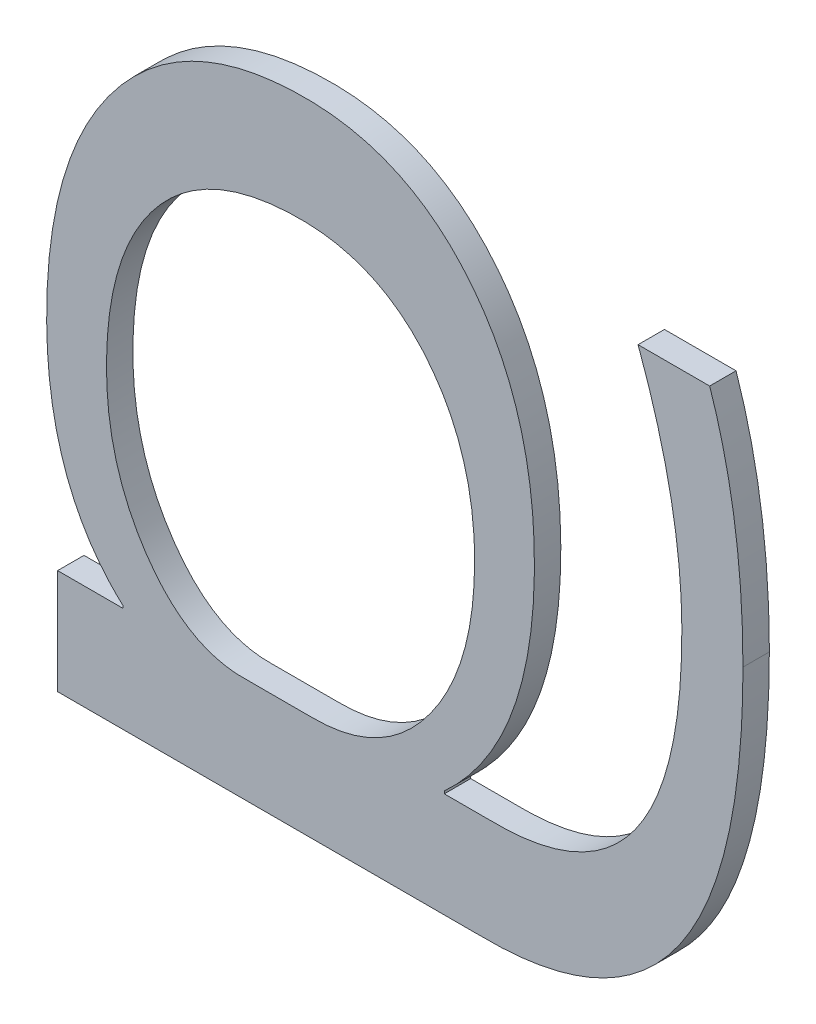
ISO-10303-21;
HEADER;
FILE_DESCRIPTION(('STEP AP214'),'2;1');
FILE_NAME('part.step','',(''),(''),'','','');
FILE_SCHEMA(('AUTOMOTIVE_DESIGN { 1 0 10303 214 1 1 1 1 }'));
ENDSEC;
DATA;
#1=APPLICATION_CONTEXT('core data for automotive mechanical design processes');
#2=APPLICATION_PROTOCOL_DEFINITION('international standard','automotive_design',2000,#1);
#3=PRODUCT_CONTEXT('',#1,'mechanical');
#4=PRODUCT('Part','Part','',(#3));
#5=PRODUCT_RELATED_PRODUCT_CATEGORY('part','',(#4));
#6=PRODUCT_DEFINITION_FORMATION('','',#4);
#7=PRODUCT_DEFINITION_CONTEXT('part definition',#1,'design');
#8=PRODUCT_DEFINITION('design','',#6,#7);
#9=PRODUCT_DEFINITION_SHAPE('','',#8);
#10=(LENGTH_UNIT() NAMED_UNIT(*) SI_UNIT(.MILLI.,.METRE.));
#11=(NAMED_UNIT(*) PLANE_ANGLE_UNIT() SI_UNIT($,.RADIAN.));
#12=(NAMED_UNIT(*) SI_UNIT($,.STERADIAN.) SOLID_ANGLE_UNIT());
#13=UNCERTAINTY_MEASURE_WITH_UNIT(LENGTH_MEASURE(1.E-05),#10,'distance_accuracy_value','');
#14=(GEOMETRIC_REPRESENTATION_CONTEXT(3) GLOBAL_UNCERTAINTY_ASSIGNED_CONTEXT((#13)) GLOBAL_UNIT_ASSIGNED_CONTEXT((#10,
#11,#12)) REPRESENTATION_CONTEXT('',''));
#15=CARTESIAN_POINT('',(0.,0.,0.));
#16=DIRECTION('',(0.,0.,1.));
#17=DIRECTION('',(1.,0.,0.));
#18=AXIS2_PLACEMENT_3D('',#15,#16,#17);
#19=CARTESIAN_POINT('',(-8.95983005625009,-22.770458436575,135.210489149433));
#20=DIRECTION('',(0.,0.,-1.));
#21=DIRECTION('',(0.,-1.,0.));
#22=AXIS2_PLACEMENT_3D('',#19,#20,#21);
#23=PLANE('',#22);
#24=CARTESIAN_POINT('',(-7.31483869507218,-28.3391887175246,135.210489149433));
#25=CARTESIAN_POINT('',(-6.63162029661121,-27.7166297496407,135.210489149433));
#26=CARTESIAN_POINT('',(-6.29001147151449,-26.8019478821879,135.210489149433));
#27=CARTESIAN_POINT('',(-6.29001147151449,-24.5990481492315,135.210489149433));
#28=CARTESIAN_POINT('',(-6.52786116650567,-23.801694366616,135.210489149433));
#29=CARTESIAN_POINT('',(-7.47925776656313,-22.6044660995682,135.210489149433));
#30=CARTESIAN_POINT('',(-8.10820170137054,-22.3051592704092,135.210489149433));
#31=CARTESIAN_POINT('',(-9.79389881675516,-22.3051592704092,135.210489149433));
#32=CARTESIAN_POINT('',(-10.5106393161385,-22.63319950104,135.210489149433));
#33=CARTESIAN_POINT('',(-11.5705852650725,-23.945361625794,135.210489149433));
#34=CARTESIAN_POINT('',(-11.8355718681491,-24.8289159376931,135.210489149433));
#35=CARTESIAN_POINT('',(-11.8355718681491,-27.0174489338707,135.210489149433));
#36=CARTESIAN_POINT('',(-11.5466407037744,-27.8171969070927,135.210489149433));
#37=CARTESIAN_POINT('',(-10.9687786556253,-28.3391887175246,135.210489149433));
#38=(BOUNDED_CURVE() B_SPLINE_CURVE(3,(#24,#25,#26,#27,#28,#29,#30,#31,#32,#33,#34,#35,#36,#37),
.UNSPECIFIED.,.F.,.F.) B_SPLINE_CURVE_WITH_KNOTS((4,2,2,2,2,2,4),(0.,0.182405901512016,
0.332963148336322,0.483520438417726,0.657429439117714,0.831338346330337,1.),
.UNSPECIFIED.) CURVE() GEOMETRIC_REPRESENTATION_ITEM() RATIONAL_B_SPLINE_CURVE((1.,1.,1.,1.,1.,
1.,1.,1.,1.,1.,1.,1.,1.,1.)) REPRESENTATION_ITEM(''));
#39=CARTESIAN_POINT('',(-7.31483869507218,-28.3391887175246,135.210489149433));
#40=VERTEX_POINT('',#39);
#41=CARTESIAN_POINT('',(-10.9687786556253,-28.3391887175246,135.210489149433));
#42=VERTEX_POINT('',#41);
#43=EDGE_CURVE('E55',#40,#42,#38,.T.);
#44=ORIENTED_EDGE('',*,*,#43,.T.);
#45=DIRECTION('',(0.,-1.,0.));
#46=VECTOR('',#45,1.);
#47=CARTESIAN_POINT('',(-10.9687786556253,5.40908312699247,135.210489149433));
#48=LINE('',#47,#46);
#49=CARTESIAN_POINT('',(-10.9687786556253,-28.3679221910822,135.210489149433));
#50=VERTEX_POINT('',#49);
#51=EDGE_CURVE('E215',#42,#50,#48,.T.);
#52=ORIENTED_EDGE('',*,*,#51,.T.);
#53=DIRECTION('',(-1.,0.,0.));
#54=VECTOR('',#53,1.);
#55=CARTESIAN_POINT('',(2.66453525910038E-13,-28.3679221910822,135.210489149433));
#56=LINE('',#55,#54);
#57=CARTESIAN_POINT('',(-11.7110601493991,-28.3679221910822,135.210489149433));
#58=VERTEX_POINT('',#57);
#59=EDGE_CURVE('E256',#50,#58,#56,.T.);
#60=ORIENTED_EDGE('',*,*,#59,.T.);
#61=DIRECTION('',(0.,-1.,0.));
#62=VECTOR('',#61,1.);
#63=CARTESIAN_POINT('',(-11.7110601493991,5.40908312699247,135.210489149433));
#64=LINE('',#63,#62);
#65=CARTESIAN_POINT('',(-11.7110601493991,-29.5603613437265,135.210489149433));
#66=VERTEX_POINT('',#65);
#67=EDGE_CURVE('E255',#58,#66,#64,.T.);
#68=ORIENTED_EDGE('',*,*,#67,.T.);
#69=CARTESIAN_POINT('',(-11.7110601493991,-29.5603613437265,135.210489149433));
#70=CARTESIAN_POINT('',(-10.0844262852164,-29.5603613437265,135.210489149433));
#71=CARTESIAN_POINT('',(-8.45779242103366,-29.5603618140089,135.210489149433));
#72=CARTESIAN_POINT('',(-4.89005303704277,-29.5603607825257,135.210489149433));
#73=CARTESIAN_POINT('',(-3.91949990300487,-28.1811540517566,135.210489149433));
#74=CARTESIAN_POINT('',(-3.91949990300487,-25.4227411163436,135.210489149433));
#75=(BOUNDED_CURVE() B_SPLINE_CURVE(3,(#69,#70,#71,#72,#73,#74),.UNSPECIFIED.,.F.,
.F.) B_SPLINE_CURVE_WITH_KNOTS((4,2,4),(0.,0.455928443507292,1.),
.UNSPECIFIED.) CURVE() GEOMETRIC_REPRESENTATION_ITEM() RATIONAL_B_SPLINE_CURVE((1.,1.,1.,1.,1.,1.)) REPRESENTATION_ITEM(''));
#76=CARTESIAN_POINT('',(-3.91949990300487,-25.4227411163436,135.210489149433));
#77=VERTEX_POINT('',#76);
#78=EDGE_CURVE('E11',#66,#77,#75,.T.);
#79=ORIENTED_EDGE('',*,*,#78,.T.);
#80=CARTESIAN_POINT('',(-3.91949990300487,-25.4227411163436,135.210489149433));
#81=CARTESIAN_POINT('',(-3.91949990300487,-24.4458030504572,135.210489149433));
#82=CARTESIAN_POINT('',(-4.04560842468644,-23.5861932063229,135.210489149433));
#83=CARTESIAN_POINT('',(-4.29782397151449,-22.8439118996158,135.210489149433));
#84=(BOUNDED_CURVE() B_SPLINE_CURVE(3,(#80,#81,#82,#83),.UNSPECIFIED.,.F.,
.F.) B_SPLINE_CURVE_WITH_KNOTS((4,4),(0.,1.),
.UNSPECIFIED.) CURVE() GEOMETRIC_REPRESENTATION_ITEM() RATIONAL_B_SPLINE_CURVE((1.,1.,1.,1.)) REPRESENTATION_ITEM(''));
#85=CARTESIAN_POINT('',(-4.29782397151449,-22.8439118996158,135.210489149433));
#86=VERTEX_POINT('',#85);
#87=EDGE_CURVE('E129',#77,#86,#84,.T.);
#88=ORIENTED_EDGE('',*,*,#87,.T.);
#89=DIRECTION('',(-1.,0.,0.));
#90=VECTOR('',#89,1.);
#91=CARTESIAN_POINT('',(2.66453525910038E-13,-22.8439118996158,135.210489149433));
#92=LINE('',#91,#90);
#93=CARTESIAN_POINT('',(-5.11193905564911,-22.8439118996158,135.210489149433));
#94=VERTEX_POINT('',#93);
#95=EDGE_CURVE('E135',#86,#94,#92,.T.);
#96=ORIENTED_EDGE('',*,*,#95,.T.);
#97=CARTESIAN_POINT('',(-5.11193905564911,-22.8439118996158,135.210489149433));
#98=CARTESIAN_POINT('',(-4.77990805507162,-23.7394384453972,135.210489149433));
#99=CARTESIAN_POINT('',(-4.61389218064911,-24.596653786635,135.210489149433));
#100=CARTESIAN_POINT('',(-4.61389218064911,-27.3838007217312,135.210489149433));
#101=CARTESIAN_POINT('',(-5.31786228281257,-28.3679221910822,135.210489149433));
#102=CARTESIAN_POINT('',(-6.92214788978372,-28.3679221910822,135.210489149433));
#103=CARTESIAN_POINT('',(-7.11849329242795,-28.3679221910822,135.210489149433));
#104=CARTESIAN_POINT('',(-7.31483869507218,-28.3679221910822,135.210489149433));
#105=(BOUNDED_CURVE() B_SPLINE_CURVE(3,(#97,#98,#99,#100,#101,#102,#103,#104),.UNSPECIFIED.,.F.,
.F.) B_SPLINE_CURVE_WITH_KNOTS((4,2,2,4),(0.,0.267473237427529,0.910347470849338,1.),
.UNSPECIFIED.) CURVE() GEOMETRIC_REPRESENTATION_ITEM() RATIONAL_B_SPLINE_CURVE((1.,1.,1.,1.,1.,
1.,1.,1.)) REPRESENTATION_ITEM(''));
#106=CARTESIAN_POINT('',(-7.31483869507218,-28.3679221910822,135.210489149433));
#107=VERTEX_POINT('',#106);
#108=EDGE_CURVE('E172',#94,#107,#105,.T.);
#109=ORIENTED_EDGE('',*,*,#108,.T.);
#110=DIRECTION('',(0.,1.,0.));
#111=VECTOR('',#110,1.);
#112=CARTESIAN_POINT('',(-7.31483869507218,5.40908312699247,135.210489149433));
#113=LINE('',#112,#111);
#114=EDGE_CURVE('E237',#107,#40,#113,.T.);
#115=ORIENTED_EDGE('',*,*,#114,.T.);
#116=EDGE_LOOP('',(#44,#52,#60,#68,#79,#88,#96,#109,#115));
#117=FACE_BOUND('',#116,.T.);
#118=CARTESIAN_POINT('',(-6.97003701237988,-25.9040268159725,135.210489149433));
#119=CARTESIAN_POINT('',(-6.97003701237988,-26.617574386059,135.210489149433));
#120=CARTESIAN_POINT('',(-7.14163918404078,-27.2066107921608,135.210489149433));
#121=CARTESIAN_POINT('',(-7.82805070831681,-28.1356597594239,135.210489149433));
#122=CARTESIAN_POINT('',(-8.26623580593785,-28.3679221910822,135.210489149433));
#123=CARTESIAN_POINT('',(-9.0675805937831,-28.3679221910822,135.210489149433));
#124=CARTESIAN_POINT('',(-9.33575969201324,-28.3679221910822,135.210489149433));
#125=CARTESIAN_POINT('',(-10.0349408585337,-28.3679221910822,135.210489149433));
#126=CARTESIAN_POINT('',(-10.4012929028442,-28.1452379447341,135.210489149433));
#127=CARTESIAN_POINT('',(-11.0046952169721,-27.2545000907216,135.210489149433));
#128=CARTESIAN_POINT('',(-11.1555466225336,-26.7181415435109,135.210489149433));
#129=CARTESIAN_POINT('',(-11.1555459531499,-25.2958348830055,135.210489149433));
#130=CARTESIAN_POINT('',(-10.9607970576415,-24.6696844448101,135.210489149433));
#131=CARTESIAN_POINT('',(-10.181800709784,-23.7550023634743,135.210489149433));
#132=CARTESIAN_POINT('',(-9.64065362444746,-23.5263318966111,135.210489149433));
#133=CARTESIAN_POINT('',(-8.34764731435131,-23.5263318966111,135.210489149433));
#134=CARTESIAN_POINT('',(-7.86795819848005,-23.7466217855155,135.210489149433));
#135=CARTESIAN_POINT('',(-7.14962122211545,-24.6277816227891,135.210489149433));
#136=CARTESIAN_POINT('',(-6.97003701237988,-25.2000567313467,135.210489149433));
#137=CARTESIAN_POINT('',(-6.97003701237988,-25.9040268159725,135.210489149433));
#138=(BOUNDED_CURVE() B_SPLINE_CURVE(3,(#118,#119,#120,#121,#122,#123,#124,#125,#126,#127,#128,
#129,#130,#131,#132,#133,#134,#135,#136,#137),.UNSPECIFIED.,.T.,
.F.) B_SPLINE_CURVE_WITH_KNOTS((4,2,2,2,2,2,2,2,2,4),(0.,0.125890394873445,0.251780691362057,
0.315102744610858,0.416870317470706,0.518637850634323,0.647595281264441,0.776552809828459,
0.888276426287641,1.),
.UNSPECIFIED.) CURVE() GEOMETRIC_REPRESENTATION_ITEM() RATIONAL_B_SPLINE_CURVE((1.,1.,1.,1.,1.,
1.,1.,1.,1.,1.,1.,1.,1.,1.,1.,1.,1.,1.,1.,1.)) REPRESENTATION_ITEM(''));
#139=CARTESIAN_POINT('',(-6.97003701237988,-25.9040268159725,135.210489149433));
#140=VERTEX_POINT('',#139);
#141=EDGE_CURVE('E246',#140,#140,#138,.T.);
#142=ORIENTED_EDGE('',*,*,#141,.T.);
#143=EDGE_LOOP('',(#142));
#144=FACE_BOUND('',#143,.T.);
#145=ADVANCED_FACE('F42',(#117,#144),#23,.F.);
#146=CARTESIAN_POINT('',(-11.7110601493991,-29.5603613437265,135.410489149433));
#147=CARTESIAN_POINT('',(-10.0844262852164,-29.5603613437265,135.410489149433));
#148=CARTESIAN_POINT('',(-8.45779242103366,-29.5603618140089,135.410489149433));
#149=CARTESIAN_POINT('',(-4.89005303704277,-29.5603607825257,135.410489149433));
#150=CARTESIAN_POINT('',(-3.91949990300487,-28.1811540517566,135.410489149433));
#151=CARTESIAN_POINT('',(-3.91949990300487,-25.4227411163436,135.410489149433));
#152=(BOUNDED_CURVE() B_SPLINE_CURVE(3,(#146,#147,#148,#149,#150,#151),.UNSPECIFIED.,.F.,
.F.) B_SPLINE_CURVE_WITH_KNOTS((4,2,4),(0.,0.455928443507292,1.),
.UNSPECIFIED.) CURVE() GEOMETRIC_REPRESENTATION_ITEM() RATIONAL_B_SPLINE_CURVE((1.,1.,1.,1.,1.,1.)) REPRESENTATION_ITEM(''));
#153=DIRECTION('',(0.,0.,-1.));
#154=VECTOR('',#153,1.);
#155=SURFACE_OF_LINEAR_EXTRUSION('',#152,#154);
#156=ORIENTED_EDGE('',*,*,#78,.F.);
#157=CARTESIAN_POINT('',(-11.7110601493991,-29.5603613437265,135.210489149433));
#158=CARTESIAN_POINT('',(-11.7110601493991,-29.5603613437265,134.910489149433));
#159=(BOUNDED_CURVE() B_SPLINE_CURVE(1,(#157,#158),.UNSPECIFIED.,.F.,
.F.) B_SPLINE_CURVE_WITH_KNOTS((2,2),(0.,1.),
.UNSPECIFIED.) CURVE() GEOMETRIC_REPRESENTATION_ITEM() RATIONAL_B_SPLINE_CURVE((1.,1.)) REPRESENTATION_ITEM(''));
#160=CARTESIAN_POINT('',(-11.7110601493991,-29.5603613437265,134.910489149433));
#161=VERTEX_POINT('',#160);
#162=EDGE_CURVE('E165',#66,#161,#159,.T.);
#163=ORIENTED_EDGE('',*,*,#162,.T.);
#164=CARTESIAN_POINT('',(-3.91949990300487,-25.4227411163436,134.910489149433));
#165=CARTESIAN_POINT('',(-3.91949990300487,-28.1811540517566,134.910489149433));
#166=CARTESIAN_POINT('',(-4.89005303704277,-29.5603607825257,134.910489149433));
#167=CARTESIAN_POINT('',(-8.45779242103366,-29.5603618140089,134.910489149433));
#168=CARTESIAN_POINT('',(-10.0844262852164,-29.5603613437265,134.910489149433));
#169=CARTESIAN_POINT('',(-11.7110601493991,-29.5603613437265,134.910489149433));
#170=(BOUNDED_CURVE() B_SPLINE_CURVE(3,(#164,#165,#166,#167,#168,#169),.UNSPECIFIED.,.F.,
.F.) B_SPLINE_CURVE_WITH_KNOTS((4,2,4),(0.,0.544071556492708,1.),
.UNSPECIFIED.) CURVE() GEOMETRIC_REPRESENTATION_ITEM() RATIONAL_B_SPLINE_CURVE((1.,1.,1.,1.,1.,1.)) REPRESENTATION_ITEM(''));
#171=CARTESIAN_POINT('',(-3.91949990300487,-25.4227411163436,134.910489149433));
#172=VERTEX_POINT('',#171);
#173=EDGE_CURVE('E46',#172,#161,#170,.T.);
#174=ORIENTED_EDGE('',*,*,#173,.F.);
#175=CARTESIAN_POINT('',(-3.91949990300487,-25.4227411163436,135.210489149433));
#176=CARTESIAN_POINT('',(-3.91949990300487,-25.4227411163436,134.910489149433));
#177=(BOUNDED_CURVE() B_SPLINE_CURVE(1,(#175,#176),.UNSPECIFIED.,.F.,
.F.) B_SPLINE_CURVE_WITH_KNOTS((2,2),(0.,1.),
.UNSPECIFIED.) CURVE() GEOMETRIC_REPRESENTATION_ITEM() RATIONAL_B_SPLINE_CURVE((1.,1.)) REPRESENTATION_ITEM(''));
#178=EDGE_CURVE('E138',#77,#172,#177,.T.);
#179=ORIENTED_EDGE('',*,*,#178,.F.);
#180=EDGE_LOOP('',(#156,#163,#174,#179));
#181=FACE_BOUND('',#180,.T.);
#182=ADVANCED_FACE('F315',(#181),#155,.F.);
#183=CARTESIAN_POINT('',(-7.31483869507218,-28.3391887175246,135.410489149433));
#184=CARTESIAN_POINT('',(-6.63162029661121,-27.7166297496407,135.410489149433));
#185=CARTESIAN_POINT('',(-6.29001147151449,-26.8019478821879,135.410489149433));
#186=CARTESIAN_POINT('',(-6.29001147151449,-24.5990481492315,135.410489149433));
#187=CARTESIAN_POINT('',(-6.52786116650567,-23.801694366616,135.410489149433));
#188=CARTESIAN_POINT('',(-7.47925776656313,-22.6044660995682,135.410489149433));
#189=CARTESIAN_POINT('',(-8.10820170137054,-22.3051592704092,135.410489149433));
#190=CARTESIAN_POINT('',(-9.79389881675516,-22.3051592704092,135.410489149433));
#191=CARTESIAN_POINT('',(-10.5106393161385,-22.63319950104,135.410489149433));
#192=CARTESIAN_POINT('',(-11.5705852650725,-23.945361625794,135.410489149433));
#193=CARTESIAN_POINT('',(-11.8355718681491,-24.8289159376931,135.410489149433));
#194=CARTESIAN_POINT('',(-11.8355718681491,-27.0174489338707,135.410489149433));
#195=CARTESIAN_POINT('',(-11.5466407037744,-27.8171969070927,135.410489149433));
#196=CARTESIAN_POINT('',(-10.9687786556253,-28.3391887175246,135.410489149433));
#197=(BOUNDED_CURVE() B_SPLINE_CURVE(3,(#183,#184,#185,#186,#187,#188,#189,#190,#191,#192,#193,
#194,#195,#196),.UNSPECIFIED.,.F.,.F.) B_SPLINE_CURVE_WITH_KNOTS((4,2,2,2,2,2,4),(0.,
0.182405901512016,0.332963148336322,0.483520438417726,0.657429439117714,0.831338346330337,1.),
.UNSPECIFIED.) CURVE() GEOMETRIC_REPRESENTATION_ITEM() RATIONAL_B_SPLINE_CURVE((1.,1.,1.,1.,1.,
1.,1.,1.,1.,1.,1.,1.,1.,1.)) REPRESENTATION_ITEM(''));
#198=DIRECTION('',(0.,0.,-1.));
#199=VECTOR('',#198,1.);
#200=SURFACE_OF_LINEAR_EXTRUSION('',#197,#199);
#201=ORIENTED_EDGE('',*,*,#43,.F.);
#202=CARTESIAN_POINT('',(-7.31483869507218,-28.3391887175246,134.910489149433));
#203=CARTESIAN_POINT('',(-7.31483869507218,-28.3391887175246,135.010489149433));
#204=CARTESIAN_POINT('',(-7.31483869507218,-28.3391887175246,135.110489149433));
#205=CARTESIAN_POINT('',(-7.31483869507218,-28.3391887175246,135.210489149433));
#206=(BOUNDED_CURVE() B_SPLINE_CURVE(3,(#202,#203,#204,#205),.UNSPECIFIED.,.F.,
.F.) B_SPLINE_CURVE_WITH_KNOTS((4,4),(0.,1.),
.UNSPECIFIED.) CURVE() GEOMETRIC_REPRESENTATION_ITEM() RATIONAL_B_SPLINE_CURVE((1.,1.,1.,1.)) REPRESENTATION_ITEM(''));
#207=CARTESIAN_POINT('',(-7.31483869507218,-28.3391887175246,134.910489149433));
#208=VERTEX_POINT('',#207);
#209=EDGE_CURVE('E154',#208,#40,#206,.T.);
#210=ORIENTED_EDGE('',*,*,#209,.F.);
#211=CARTESIAN_POINT('',(-10.9687786556253,-28.3391887175246,134.910489149433));
#212=CARTESIAN_POINT('',(-11.5466407037744,-27.8171969070927,134.910489149433));
#213=CARTESIAN_POINT('',(-11.8355718681491,-27.0174489338707,134.910489149433));
#214=CARTESIAN_POINT('',(-11.8355718681491,-24.8289159376931,134.910489149433));
#215=CARTESIAN_POINT('',(-11.5705852650725,-23.945361625794,134.910489149433));
#216=CARTESIAN_POINT('',(-10.5106393161385,-22.63319950104,134.910489149433));
#217=CARTESIAN_POINT('',(-9.79389881675516,-22.3051592704092,134.910489149433));
#218=CARTESIAN_POINT('',(-8.10820170137054,-22.3051592704092,134.910489149433));
#219=CARTESIAN_POINT('',(-7.47925776656313,-22.6044660995682,134.910489149433));
#220=CARTESIAN_POINT('',(-6.52786116650567,-23.801694366616,134.910489149433));
#221=CARTESIAN_POINT('',(-6.29001147151449,-24.5990481492315,134.910489149433));
#222=CARTESIAN_POINT('',(-6.29001147151449,-26.8019478821879,134.910489149433));
#223=CARTESIAN_POINT('',(-6.63162029661121,-27.7166297496407,134.910489149433));
#224=CARTESIAN_POINT('',(-7.31483869507218,-28.3391887175246,134.910489149433));
#225=(BOUNDED_CURVE() B_SPLINE_CURVE(3,(#211,#212,#213,#214,#215,#216,#217,#218,#219,#220,#221,
#222,#223,#224),.UNSPECIFIED.,.F.,.F.) B_SPLINE_CURVE_WITH_KNOTS((4,2,2,2,2,2,4),(0.,
0.168661653669663,0.342570560882286,0.516479561582274,0.667036851663678,0.817594098487984,1.),
.UNSPECIFIED.) CURVE() GEOMETRIC_REPRESENTATION_ITEM() RATIONAL_B_SPLINE_CURVE((1.,1.,1.,1.,1.,
1.,1.,1.,1.,1.,1.,1.,1.,1.)) REPRESENTATION_ITEM(''));
#226=CARTESIAN_POINT('',(-10.9687786556253,-28.3391887175246,134.910489149433));
#227=VERTEX_POINT('',#226);
#228=EDGE_CURVE('E331',#227,#208,#225,.T.);
#229=ORIENTED_EDGE('',*,*,#228,.F.);
#230=CARTESIAN_POINT('',(-10.9687786556253,-28.3391887175246,135.210489149433));
#231=CARTESIAN_POINT('',(-10.9687786556253,-28.3391887175246,135.110489149433));
#232=CARTESIAN_POINT('',(-10.9687786556253,-28.3391887175246,135.010489149433));
#233=CARTESIAN_POINT('',(-10.9687786556253,-28.3391887175246,134.910489149433));
#234=(BOUNDED_CURVE() B_SPLINE_CURVE(3,(#230,#231,#232,#233),.UNSPECIFIED.,.F.,
.F.) B_SPLINE_CURVE_WITH_KNOTS((4,4),(0.,1.),
.UNSPECIFIED.) CURVE() GEOMETRIC_REPRESENTATION_ITEM() RATIONAL_B_SPLINE_CURVE((1.,1.,1.,1.)) REPRESENTATION_ITEM(''));
#235=EDGE_CURVE('E216',#42,#227,#234,.T.);
#236=ORIENTED_EDGE('',*,*,#235,.F.);
#237=EDGE_LOOP('',(#201,#210,#229,#236));
#238=FACE_BOUND('',#237,.T.);
#239=ADVANCED_FACE('F404',(#238),#200,.F.);
#240=CARTESIAN_POINT('',(-5.11193905564911,-22.8439118996158,135.410489149433));
#241=CARTESIAN_POINT('',(-4.77990805507162,-23.7394384453972,135.410489149433));
#242=CARTESIAN_POINT('',(-4.61389218064911,-24.596653786635,135.410489149433));
#243=CARTESIAN_POINT('',(-4.61389218064911,-27.3838007217312,135.410489149433));
#244=CARTESIAN_POINT('',(-5.31786228281257,-28.3679221910822,135.410489149433));
#245=CARTESIAN_POINT('',(-6.92214788978372,-28.3679221910822,135.410489149433));
#246=CARTESIAN_POINT('',(-7.11849329242795,-28.3679221910822,135.410489149433));
#247=CARTESIAN_POINT('',(-7.31483869507218,-28.3679221910822,135.410489149433));
#248=(BOUNDED_CURVE() B_SPLINE_CURVE(3,(#240,#241,#242,#243,#244,#245,#246,#247),.UNSPECIFIED.,
.F.,.F.) B_SPLINE_CURVE_WITH_KNOTS((4,2,2,4),(0.,0.267473237427529,0.910347470849338,1.),
.UNSPECIFIED.) CURVE() GEOMETRIC_REPRESENTATION_ITEM() RATIONAL_B_SPLINE_CURVE((1.,1.,1.,1.,1.,
1.,1.,1.)) REPRESENTATION_ITEM(''));
#249=DIRECTION('',(0.,0.,-1.));
#250=VECTOR('',#249,1.);
#251=SURFACE_OF_LINEAR_EXTRUSION('',#248,#250);
#252=ORIENTED_EDGE('',*,*,#108,.F.);
#253=CARTESIAN_POINT('',(-5.11193905564911,-22.8439118996158,135.210489149433));
#254=CARTESIAN_POINT('',(-5.11193905564911,-22.8439118996158,134.910489149433));
#255=(BOUNDED_CURVE() B_SPLINE_CURVE(1,(#253,#254),.UNSPECIFIED.,.F.,
.F.) B_SPLINE_CURVE_WITH_KNOTS((2,2),(0.,1.),
.UNSPECIFIED.) CURVE() GEOMETRIC_REPRESENTATION_ITEM() RATIONAL_B_SPLINE_CURVE((1.,1.)) REPRESENTATION_ITEM(''));
#256=CARTESIAN_POINT('',(-5.11193905564911,-22.8439118996158,134.910489149433));
#257=VERTEX_POINT('',#256);
#258=EDGE_CURVE('E139',#94,#257,#255,.T.);
#259=ORIENTED_EDGE('',*,*,#258,.T.);
#260=CARTESIAN_POINT('',(-7.31483869507218,-28.3679221910822,134.910489149433));
#261=CARTESIAN_POINT('',(-7.11849329242795,-28.3679221910822,134.910489149433));
#262=CARTESIAN_POINT('',(-6.92214788978372,-28.3679221910822,134.910489149433));
#263=CARTESIAN_POINT('',(-5.31786228281257,-28.3679221910822,134.910489149433));
#264=CARTESIAN_POINT('',(-4.61389218064911,-27.3838007217312,134.910489149433));
#265=CARTESIAN_POINT('',(-4.61389218064911,-24.596653786635,134.910489149433));
#266=CARTESIAN_POINT('',(-4.77990805507162,-23.7394384453972,134.910489149433));
#267=CARTESIAN_POINT('',(-5.11193905564911,-22.8439118996158,134.910489149433));
#268=(BOUNDED_CURVE() B_SPLINE_CURVE(3,(#260,#261,#262,#263,#264,#265,#266,#267),.UNSPECIFIED.,
.F.,.F.) B_SPLINE_CURVE_WITH_KNOTS((4,2,2,4),(0.,0.0896525291506619,0.732526762572471,1.),
.UNSPECIFIED.) CURVE() GEOMETRIC_REPRESENTATION_ITEM() RATIONAL_B_SPLINE_CURVE((1.,1.,1.,1.,1.,
1.,1.,1.)) REPRESENTATION_ITEM(''));
#269=CARTESIAN_POINT('',(-7.31483869507218,-28.3679221910822,134.910489149433));
#270=VERTEX_POINT('',#269);
#271=EDGE_CURVE('E197',#270,#257,#268,.T.);
#272=ORIENTED_EDGE('',*,*,#271,.F.);
#273=CARTESIAN_POINT('',(-7.31483869507218,-28.3679221910821,135.210489149433));
#274=CARTESIAN_POINT('',(-7.31483869507218,-28.3679221910821,135.110489149433));
#275=CARTESIAN_POINT('',(-7.31483869507218,-28.3679221910821,135.010489149433));
#276=CARTESIAN_POINT('',(-7.31483869507218,-28.3679221910821,134.910489149433));
#277=(BOUNDED_CURVE() B_SPLINE_CURVE(3,(#273,#274,#275,#276),.UNSPECIFIED.,.F.,
.F.) B_SPLINE_CURVE_WITH_KNOTS((4,4),(0.,1.),
.UNSPECIFIED.) CURVE() GEOMETRIC_REPRESENTATION_ITEM() RATIONAL_B_SPLINE_CURVE((1.,1.,1.,1.)) REPRESENTATION_ITEM(''));
#278=EDGE_CURVE('E161',#107,#270,#277,.T.);
#279=ORIENTED_EDGE('',*,*,#278,.F.);
#280=EDGE_LOOP('',(#252,#259,#272,#279));
#281=FACE_BOUND('',#280,.T.);
#282=ADVANCED_FACE('F371',(#281),#251,.F.);
#283=CARTESIAN_POINT('',(-3.91949990300487,-25.4227411163436,135.410489149433));
#284=CARTESIAN_POINT('',(-3.91949990300487,-24.4458030504572,135.410489149433));
#285=CARTESIAN_POINT('',(-4.04560842468644,-23.5861932063229,135.410489149433));
#286=CARTESIAN_POINT('',(-4.29782397151449,-22.8439118996158,135.410489149433));
#287=(BOUNDED_CURVE() B_SPLINE_CURVE(3,(#283,#284,#285,#286),.UNSPECIFIED.,.F.,
.F.) B_SPLINE_CURVE_WITH_KNOTS((4,4),(0.,1.),
.UNSPECIFIED.) CURVE() GEOMETRIC_REPRESENTATION_ITEM() RATIONAL_B_SPLINE_CURVE((1.,1.,1.,1.)) REPRESENTATION_ITEM(''));
#288=DIRECTION('',(0.,0.,-1.));
#289=VECTOR('',#288,1.);
#290=SURFACE_OF_LINEAR_EXTRUSION('',#287,#289);
#291=ORIENTED_EDGE('',*,*,#87,.F.);
#292=ORIENTED_EDGE('',*,*,#178,.T.);
#293=CARTESIAN_POINT('',(-4.29782397151449,-22.8439118996158,134.910489149433));
#294=CARTESIAN_POINT('',(-4.04560842468644,-23.5861932063229,134.910489149433));
#295=CARTESIAN_POINT('',(-3.91949990300487,-24.4458030504572,134.910489149433));
#296=CARTESIAN_POINT('',(-3.91949990300487,-25.4227411163436,134.910489149433));
#297=(BOUNDED_CURVE() B_SPLINE_CURVE(3,(#293,#294,#295,#296),.UNSPECIFIED.,.F.,
.F.) B_SPLINE_CURVE_WITH_KNOTS((4,4),(0.,1.),
.UNSPECIFIED.) CURVE() GEOMETRIC_REPRESENTATION_ITEM() RATIONAL_B_SPLINE_CURVE((1.,1.,1.,1.)) REPRESENTATION_ITEM(''));
#298=CARTESIAN_POINT('',(-4.29782397151449,-22.8439118996158,134.910489149433));
#299=VERTEX_POINT('',#298);
#300=EDGE_CURVE('E145',#299,#172,#297,.T.);
#301=ORIENTED_EDGE('',*,*,#300,.F.);
#302=CARTESIAN_POINT('',(-4.29782397151449,-22.8439118996158,135.210489149433));
#303=CARTESIAN_POINT('',(-4.29782397151449,-22.8439118996158,135.110489149433));
#304=CARTESIAN_POINT('',(-4.29782397151449,-22.8439118996158,135.010489149433));
#305=CARTESIAN_POINT('',(-4.29782397151449,-22.8439118996158,134.910489149433));
#306=(BOUNDED_CURVE() B_SPLINE_CURVE(3,(#302,#303,#304,#305),.UNSPECIFIED.,.F.,
.F.) B_SPLINE_CURVE_WITH_KNOTS((4,4),(0.,1.),
.UNSPECIFIED.) CURVE() GEOMETRIC_REPRESENTATION_ITEM() RATIONAL_B_SPLINE_CURVE((1.,1.,1.,1.)) REPRESENTATION_ITEM(''));
#307=EDGE_CURVE('E142',#86,#299,#306,.T.);
#308=ORIENTED_EDGE('',*,*,#307,.F.);
#309=EDGE_LOOP('',(#291,#292,#301,#308));
#310=FACE_BOUND('',#309,.T.);
#311=ADVANCED_FACE('F143',(#310),#290,.F.);
#312=CARTESIAN_POINT('',(-5.11193905564911,-22.8439118996158,135.410489149433));
#313=DIRECTION('',(0.,1.,0.));
#314=DIRECTION('',(1.,0.,0.));
#315=AXIS2_PLACEMENT_3D('',#312,#313,#314);
#316=PLANE('',#315);
#317=ORIENTED_EDGE('',*,*,#95,.F.);
#318=ORIENTED_EDGE('',*,*,#307,.T.);
#319=CARTESIAN_POINT('',(-5.11193905564911,-22.8439118996158,134.910489149433));
#320=CARTESIAN_POINT('',(-4.84056736093757,-22.8439118996158,134.910489149433));
#321=CARTESIAN_POINT('',(-4.56919566622603,-22.8439118996158,134.910489149433));
#322=CARTESIAN_POINT('',(-4.29782397151449,-22.8439118996158,134.910489149433));
#323=(BOUNDED_CURVE() B_SPLINE_CURVE(3,(#319,#320,#321,#322),.UNSPECIFIED.,.F.,
.F.) B_SPLINE_CURVE_WITH_KNOTS((4,4),(0.,1.),
.UNSPECIFIED.) CURVE() GEOMETRIC_REPRESENTATION_ITEM() RATIONAL_B_SPLINE_CURVE((1.,1.,1.,1.)) REPRESENTATION_ITEM(''));
#324=EDGE_CURVE('E206',#257,#299,#323,.T.);
#325=ORIENTED_EDGE('',*,*,#324,.F.);
#326=ORIENTED_EDGE('',*,*,#258,.F.);
#327=EDGE_LOOP('',(#317,#318,#325,#326));
#328=FACE_BOUND('',#327,.T.);
#329=ADVANCED_FACE('F152',(#328),#316,.T.);
#330=CARTESIAN_POINT('',(-7.31483869507218,-28.3391887175246,135.410489149433));
#331=DIRECTION('',(1.,0.,0.));
#332=DIRECTION('',(0.,1.,0.));
#333=AXIS2_PLACEMENT_3D('',#330,#331,#332);
#334=PLANE('',#333);
#335=ORIENTED_EDGE('',*,*,#114,.F.);
#336=ORIENTED_EDGE('',*,*,#278,.T.);
#337=CARTESIAN_POINT('',(-7.31483869507218,-28.3391887175246,134.910489149433));
#338=CARTESIAN_POINT('',(-7.31483869507218,-28.3487665420438,134.910489149433));
#339=CARTESIAN_POINT('',(-7.31483869507218,-28.3583443665629,134.910489149433));
#340=CARTESIAN_POINT('',(-7.31483869507218,-28.3679221910822,134.910489149433));
#341=(BOUNDED_CURVE() B_SPLINE_CURVE(3,(#337,#338,#339,#340),.UNSPECIFIED.,.F.,
.F.) B_SPLINE_CURVE_WITH_KNOTS((4,4),(0.,1.),
.UNSPECIFIED.) CURVE() GEOMETRIC_REPRESENTATION_ITEM() RATIONAL_B_SPLINE_CURVE((1.,1.,1.,1.)) REPRESENTATION_ITEM(''));
#342=EDGE_CURVE('E207',#208,#270,#341,.T.);
#343=ORIENTED_EDGE('',*,*,#342,.F.);
#344=ORIENTED_EDGE('',*,*,#209,.T.);
#345=EDGE_LOOP('',(#335,#336,#343,#344));
#346=FACE_BOUND('',#345,.T.);
#347=ADVANCED_FACE('F44',(#346),#334,.T.);
#348=CARTESIAN_POINT('',(-11.7110601493991,-29.5603613437265,135.410489149433));
#349=DIRECTION('',(-1.,0.,0.));
#350=DIRECTION('',(0.,0.,1.));
#351=AXIS2_PLACEMENT_3D('',#348,#349,#350);
#352=PLANE('',#351);
#353=ORIENTED_EDGE('',*,*,#67,.F.);
#354=CARTESIAN_POINT('',(-11.7110601493991,-28.3679221910821,135.210489149433));
#355=CARTESIAN_POINT('',(-11.7110601493991,-28.3679221910821,135.110489149433));
#356=CARTESIAN_POINT('',(-11.7110601493991,-28.3679221910821,135.010489149433));
#357=CARTESIAN_POINT('',(-11.7110601493991,-28.3679221910821,134.910489149433));
#358=(BOUNDED_CURVE() B_SPLINE_CURVE(3,(#354,#355,#356,#357),.UNSPECIFIED.,.F.,
.F.) B_SPLINE_CURVE_WITH_KNOTS((4,4),(0.,1.),
.UNSPECIFIED.) CURVE() GEOMETRIC_REPRESENTATION_ITEM() RATIONAL_B_SPLINE_CURVE((1.,1.,1.,1.)) REPRESENTATION_ITEM(''));
#359=CARTESIAN_POINT('',(-11.7110601493991,-28.3679221910822,134.910489149433));
#360=VERTEX_POINT('',#359);
#361=EDGE_CURVE('E247',#58,#360,#358,.T.);
#362=ORIENTED_EDGE('',*,*,#361,.T.);
#363=CARTESIAN_POINT('',(-11.7110601493991,-29.5603613437265,134.910489149433));
#364=CARTESIAN_POINT('',(-11.7110601493991,-29.1628816261784,134.910489149433));
#365=CARTESIAN_POINT('',(-11.7110601493991,-28.7654019086302,134.910489149433));
#366=CARTESIAN_POINT('',(-11.7110601493991,-28.3679221910822,134.910489149433));
#367=(BOUNDED_CURVE() B_SPLINE_CURVE(3,(#363,#364,#365,#366),.UNSPECIFIED.,.F.,
.F.) B_SPLINE_CURVE_WITH_KNOTS((4,4),(0.,1.),
.UNSPECIFIED.) CURVE() GEOMETRIC_REPRESENTATION_ITEM() RATIONAL_B_SPLINE_CURVE((1.,1.,1.,1.)) REPRESENTATION_ITEM(''));
#368=EDGE_CURVE('E293',#161,#360,#367,.T.);
#369=ORIENTED_EDGE('',*,*,#368,.F.);
#370=ORIENTED_EDGE('',*,*,#162,.F.);
#371=EDGE_LOOP('',(#353,#362,#369,#370));
#372=FACE_BOUND('',#371,.T.);
#373=ADVANCED_FACE('F319',(#372),#352,.T.);
#374=CARTESIAN_POINT('',(-11.7110601493991,-28.3679221910822,135.410489149433));
#375=DIRECTION('',(0.,1.,0.));
#376=DIRECTION('',(1.,0.,0.));
#377=AXIS2_PLACEMENT_3D('',#374,#375,#376);
#378=PLANE('',#377);
#379=ORIENTED_EDGE('',*,*,#59,.F.);
#380=CARTESIAN_POINT('',(-10.9687786556253,-28.3679221910822,135.210489149433));
#381=CARTESIAN_POINT('',(-10.9687786556253,-28.3679221910822,135.110489149433));
#382=CARTESIAN_POINT('',(-10.9687786556253,-28.3679221910822,135.010489149433));
#383=CARTESIAN_POINT('',(-10.9687786556253,-28.3679221910822,134.910489149433));
#384=(BOUNDED_CURVE() B_SPLINE_CURVE(3,(#380,#381,#382,#383),.UNSPECIFIED.,.F.,
.F.) B_SPLINE_CURVE_WITH_KNOTS((4,4),(0.,1.),
.UNSPECIFIED.) CURVE() GEOMETRIC_REPRESENTATION_ITEM() RATIONAL_B_SPLINE_CURVE((1.,1.,1.,1.)) REPRESENTATION_ITEM(''));
#385=CARTESIAN_POINT('',(-10.9687786556253,-28.3679221910822,134.910489149433));
#386=VERTEX_POINT('',#385);
#387=EDGE_CURVE('E223',#50,#386,#384,.T.);
#388=ORIENTED_EDGE('',*,*,#387,.T.);
#389=CARTESIAN_POINT('',(-11.7110601493991,-28.3679221910822,134.910489149433));
#390=CARTESIAN_POINT('',(-11.4636329848078,-28.3679221910822,134.910489149433));
#391=CARTESIAN_POINT('',(-11.2162058202165,-28.3679221910822,134.910489149433));
#392=CARTESIAN_POINT('',(-10.9687786556253,-28.3679221910822,134.910489149433));
#393=(BOUNDED_CURVE() B_SPLINE_CURVE(3,(#389,#390,#391,#392),.UNSPECIFIED.,.F.,
.F.) B_SPLINE_CURVE_WITH_KNOTS((4,4),(0.,1.),
.UNSPECIFIED.) CURVE() GEOMETRIC_REPRESENTATION_ITEM() RATIONAL_B_SPLINE_CURVE((1.,1.,1.,1.)) REPRESENTATION_ITEM(''));
#394=EDGE_CURVE('E284',#360,#386,#393,.T.);
#395=ORIENTED_EDGE('',*,*,#394,.F.);
#396=ORIENTED_EDGE('',*,*,#361,.F.);
#397=EDGE_LOOP('',(#379,#388,#395,#396));
#398=FACE_BOUND('',#397,.T.);
#399=ADVANCED_FACE('F324',(#398),#378,.T.);
#400=CARTESIAN_POINT('',(-10.9687786556253,-28.3679221910822,135.410489149433));
#401=DIRECTION('',(-1.,0.,0.));
#402=DIRECTION('',(0.,0.,1.));
#403=AXIS2_PLACEMENT_3D('',#400,#401,#402);
#404=PLANE('',#403);
#405=ORIENTED_EDGE('',*,*,#51,.F.);
#406=ORIENTED_EDGE('',*,*,#235,.T.);
#407=CARTESIAN_POINT('',(-10.9687786556253,-28.3679221910822,134.910489149433));
#408=CARTESIAN_POINT('',(-10.9687786556253,-28.3583443665629,134.910489149433));
#409=CARTESIAN_POINT('',(-10.9687786556253,-28.3487665420438,134.910489149433));
#410=CARTESIAN_POINT('',(-10.9687786556253,-28.3391887175246,134.910489149433));
#411=(BOUNDED_CURVE() B_SPLINE_CURVE(3,(#407,#408,#409,#410),.UNSPECIFIED.,.F.,
.F.) B_SPLINE_CURVE_WITH_KNOTS((4,4),(0.,1.),
.UNSPECIFIED.) CURVE() GEOMETRIC_REPRESENTATION_ITEM() RATIONAL_B_SPLINE_CURVE((1.,1.,1.,1.)) REPRESENTATION_ITEM(''));
#412=EDGE_CURVE('E292',#386,#227,#411,.T.);
#413=ORIENTED_EDGE('',*,*,#412,.F.);
#414=ORIENTED_EDGE('',*,*,#387,.F.);
#415=EDGE_LOOP('',(#405,#406,#413,#414));
#416=FACE_BOUND('',#415,.T.);
#417=ADVANCED_FACE('F384',(#416),#404,.T.);
#418=CARTESIAN_POINT('',(-6.37855598266144,-29.5332121234245,134.910489149433));
#419=DIRECTION('',(0.,0.,1.));
#420=DIRECTION('',(1.,0.,0.));
#421=AXIS2_PLACEMENT_3D('',#418,#419,#420);
#422=PLANE('',#421);
#423=ORIENTED_EDGE('',*,*,#173,.T.);
#424=ORIENTED_EDGE('',*,*,#368,.T.);
#425=ORIENTED_EDGE('',*,*,#394,.T.);
#426=ORIENTED_EDGE('',*,*,#412,.T.);
#427=ORIENTED_EDGE('',*,*,#228,.T.);
#428=ORIENTED_EDGE('',*,*,#342,.T.);
#429=ORIENTED_EDGE('',*,*,#271,.T.);
#430=ORIENTED_EDGE('',*,*,#324,.T.);
#431=ORIENTED_EDGE('',*,*,#300,.T.);
#432=EDGE_LOOP('',(#423,#424,#425,#426,#427,#428,#429,#430,#431));
#433=FACE_BOUND('',#432,.T.);
#434=CARTESIAN_POINT('',(-6.97003701237988,-25.9040268159725,134.910489149433));
#435=CARTESIAN_POINT('',(-6.97003701237988,-25.2000567313467,134.910489149433));
#436=CARTESIAN_POINT('',(-7.14962122211545,-24.6277816227891,134.910489149433));
#437=CARTESIAN_POINT('',(-7.86795819848005,-23.7466217855155,134.910489149433));
#438=CARTESIAN_POINT('',(-8.34764731435131,-23.5263318966111,134.910489149433));
#439=CARTESIAN_POINT('',(-9.64065362444746,-23.5263318966111,134.910489149433));
#440=CARTESIAN_POINT('',(-10.181800709784,-23.7550023634743,134.910489149433));
#441=CARTESIAN_POINT('',(-10.9607970576415,-24.6696844448101,134.910489149433));
#442=CARTESIAN_POINT('',(-11.1555459531499,-25.2958348830055,134.910489149433));
#443=CARTESIAN_POINT('',(-11.1555466225336,-26.7181415435109,134.910489149433));
#444=CARTESIAN_POINT('',(-11.0046952169721,-27.2545000907216,134.910489149433));
#445=CARTESIAN_POINT('',(-10.4012929028442,-28.1452379447341,134.910489149433));
#446=CARTESIAN_POINT('',(-10.0349408585337,-28.3679221910822,134.910489149433));
#447=CARTESIAN_POINT('',(-9.33575969201324,-28.3679221910822,134.910489149433));
#448=CARTESIAN_POINT('',(-9.0675805937831,-28.3679221910822,134.910489149433));
#449=CARTESIAN_POINT('',(-8.26623580593785,-28.3679221910822,134.910489149433));
#450=CARTESIAN_POINT('',(-7.82805070831681,-28.1356597594239,134.910489149433));
#451=CARTESIAN_POINT('',(-7.14163918404078,-27.2066107921608,134.910489149433));
#452=CARTESIAN_POINT('',(-6.97003701237988,-26.617574386059,134.910489149433));
#453=CARTESIAN_POINT('',(-6.97003701237988,-25.9040268159725,134.910489149433));
#454=(BOUNDED_CURVE() B_SPLINE_CURVE(3,(#434,#435,#436,#437,#438,#439,#440,#441,#442,#443,#444,
#445,#446,#447,#448,#449,#450,#451,#452,#453),.UNSPECIFIED.,.T.,
.F.) B_SPLINE_CURVE_WITH_KNOTS((4,2,2,2,2,2,2,2,2,4),(0.,0.111723573712359,0.223447190171541,
0.352404718735559,0.481362149365677,0.583129682529294,0.684897255389142,0.748219308637943,
0.874109605126555,1.),
.UNSPECIFIED.) CURVE() GEOMETRIC_REPRESENTATION_ITEM() RATIONAL_B_SPLINE_CURVE((1.,1.,1.,1.,1.,
1.,1.,1.,1.,1.,1.,1.,1.,1.,1.,1.,1.,1.,1.,1.)) REPRESENTATION_ITEM(''));
#455=CARTESIAN_POINT('',(-6.97003701237988,-25.9040268159725,134.910489149433));
#456=VERTEX_POINT('',#455);
#457=EDGE_CURVE('E238',#456,#456,#454,.T.);
#458=ORIENTED_EDGE('',*,*,#457,.T.);
#459=EDGE_LOOP('',(#458));
#460=FACE_BOUND('',#459,.T.);
#461=ADVANCED_FACE('F312',(#433,#460),#422,.F.);
#462=CARTESIAN_POINT('',(-6.97003701237988,-25.9040268159725,135.410489149433));
#463=CARTESIAN_POINT('',(-6.97003701237988,-26.617574386059,135.410489149433));
#464=CARTESIAN_POINT('',(-7.14163918404078,-27.2066107921608,135.410489149433));
#465=CARTESIAN_POINT('',(-7.82805070831681,-28.1356597594239,135.410489149433));
#466=CARTESIAN_POINT('',(-8.26623580593785,-28.3679221910822,135.410489149433));
#467=CARTESIAN_POINT('',(-9.0675805937831,-28.3679221910822,135.410489149433));
#468=CARTESIAN_POINT('',(-9.33575969201324,-28.3679221910822,135.410489149433));
#469=CARTESIAN_POINT('',(-10.0349408585337,-28.3679221910822,135.410489149433));
#470=CARTESIAN_POINT('',(-10.4012929028442,-28.1452379447341,135.410489149433));
#471=CARTESIAN_POINT('',(-11.0046952169721,-27.2545000907216,135.410489149433));
#472=CARTESIAN_POINT('',(-11.1555466225336,-26.7181415435109,135.410489149433));
#473=CARTESIAN_POINT('',(-11.1555459531499,-25.2958348830055,135.410489149433));
#474=CARTESIAN_POINT('',(-10.9607970576415,-24.6696844448101,135.410489149433));
#475=CARTESIAN_POINT('',(-10.181800709784,-23.7550023634743,135.410489149433));
#476=CARTESIAN_POINT('',(-9.64065362444746,-23.5263318966111,135.410489149433));
#477=CARTESIAN_POINT('',(-8.34764731435131,-23.5263318966111,135.410489149433));
#478=CARTESIAN_POINT('',(-7.86795819848005,-23.7466217855155,135.410489149433));
#479=CARTESIAN_POINT('',(-7.14962122211545,-24.6277816227891,135.410489149433));
#480=CARTESIAN_POINT('',(-6.97003701237988,-25.2000567313467,135.410489149433));
#481=CARTESIAN_POINT('',(-6.97003701237988,-25.9040268159725,135.410489149433));
#482=(BOUNDED_CURVE() B_SPLINE_CURVE(3,(#462,#463,#464,#465,#466,#467,#468,#469,#470,#471,#472,
#473,#474,#475,#476,#477,#478,#479,#480,#481),.UNSPECIFIED.,.T.,
.F.) B_SPLINE_CURVE_WITH_KNOTS((4,2,2,2,2,2,2,2,2,4),(0.,0.125890394873445,0.251780691362057,
0.315102744610858,0.416870317470706,0.518637850634323,0.647595281264441,0.776552809828459,
0.888276426287641,1.),
.UNSPECIFIED.) CURVE() GEOMETRIC_REPRESENTATION_ITEM() RATIONAL_B_SPLINE_CURVE((1.,1.,1.,1.,1.,
1.,1.,1.,1.,1.,1.,1.,1.,1.,1.,1.,1.,1.,1.,1.)) REPRESENTATION_ITEM(''));
#483=DIRECTION('',(0.,0.,-1.));
#484=VECTOR('',#483,1.);
#485=SURFACE_OF_LINEAR_EXTRUSION('',#482,#484);
#486=ORIENTED_EDGE('',*,*,#141,.F.);
#487=EDGE_LOOP('',(#486));
#488=FACE_BOUND('',#487,.T.);
#489=ORIENTED_EDGE('',*,*,#457,.F.);
#490=EDGE_LOOP('',(#489));
#491=FACE_BOUND('',#490,.T.);
#492=ADVANCED_FACE('F409',(#488,#491),#485,.F.);
#493=CLOSED_SHELL('',(#145,#182,#239,#282,#311,#329,#347,#373,#399,#417,#461,#492));
#494=MANIFOLD_SOLID_BREP('B2',#493);
#495=ADVANCED_BREP_SHAPE_REPRESENTATION('',(#18,#494),#14);
#496=SHAPE_DEFINITION_REPRESENTATION(#9,#495);
ENDSEC;
END-ISO-10303-21;
